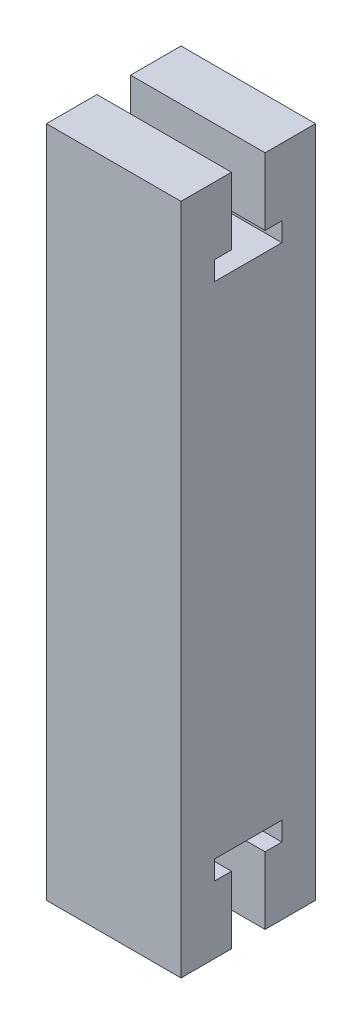
ISO-10303-21;
HEADER;
FILE_DESCRIPTION(('STEP AP214'),'2;1');
FILE_NAME('part.step','',(''),(''),'','','');
FILE_SCHEMA(('AUTOMOTIVE_DESIGN { 1 0 10303 214 1 1 1 1 }'));
ENDSEC;
DATA;
#1=APPLICATION_CONTEXT('core data for automotive mechanical design processes');
#2=APPLICATION_PROTOCOL_DEFINITION('international standard','automotive_design',2000,#1);
#3=PRODUCT_CONTEXT('',#1,'mechanical');
#4=PRODUCT('Part','Part','',(#3));
#5=PRODUCT_RELATED_PRODUCT_CATEGORY('part','',(#4));
#6=PRODUCT_DEFINITION_FORMATION('','',#4);
#7=PRODUCT_DEFINITION_CONTEXT('part definition',#1,'design');
#8=PRODUCT_DEFINITION('design','',#6,#7);
#9=PRODUCT_DEFINITION_SHAPE('','',#8);
#10=(LENGTH_UNIT() NAMED_UNIT(*) SI_UNIT(.MILLI.,.METRE.));
#11=(NAMED_UNIT(*) PLANE_ANGLE_UNIT() SI_UNIT($,.RADIAN.));
#12=(NAMED_UNIT(*) SI_UNIT($,.STERADIAN.) SOLID_ANGLE_UNIT());
#13=UNCERTAINTY_MEASURE_WITH_UNIT(LENGTH_MEASURE(1.E-05),#10,'distance_accuracy_value','');
#14=(GEOMETRIC_REPRESENTATION_CONTEXT(3) GLOBAL_UNCERTAINTY_ASSIGNED_CONTEXT((#13)) GLOBAL_UNIT_ASSIGNED_CONTEXT((#10,
#11,#12)) REPRESENTATION_CONTEXT('',''));
#15=CARTESIAN_POINT('',(0.,0.,0.));
#16=DIRECTION('',(0.,0.,1.));
#17=DIRECTION('',(1.,0.,0.));
#18=AXIS2_PLACEMENT_3D('',#15,#16,#17);
#19=CARTESIAN_POINT('',(0.,-50.,0.));
#20=DIRECTION('',(0.,1.,0.));
#21=DIRECTION('',(0.,0.,1.));
#22=AXIS2_PLACEMENT_3D('',#19,#20,#21);
#23=PLANE('',#22);
#24=DIRECTION('',(0.,0.,1.));
#25=VECTOR('',#24,1.);
#26=CARTESIAN_POINT('',(0.,-50.,0.));
#27=LINE('',#26,#25);
#28=CARTESIAN_POINT('',(0.,-50.,12.5));
#29=VERTEX_POINT('',#28);
#30=CARTESIAN_POINT('',(0.,-50.,20.));
#31=VERTEX_POINT('',#30);
#32=EDGE_CURVE('E306',#29,#31,#27,.T.);
#33=ORIENTED_EDGE('',*,*,#32,.F.);
#34=DIRECTION('',(-1.,0.,0.));
#35=VECTOR('',#34,1.);
#36=CARTESIAN_POINT('',(20.,-50.,12.5));
#37=LINE('',#36,#35);
#38=CARTESIAN_POINT('',(20.,-50.,12.5));
#39=VERTEX_POINT('',#38);
#40=EDGE_CURVE('E285',#39,#29,#37,.T.);
#41=ORIENTED_EDGE('',*,*,#40,.F.);
#42=DIRECTION('',(0.,0.,-1.));
#43=VECTOR('',#42,1.);
#44=CARTESIAN_POINT('',(20.,-50.,0.));
#45=LINE('',#44,#43);
#46=CARTESIAN_POINT('',(20.,-50.,20.));
#47=VERTEX_POINT('',#46);
#48=EDGE_CURVE('E314',#47,#39,#45,.T.);
#49=ORIENTED_EDGE('',*,*,#48,.F.);
#50=DIRECTION('',(1.,0.,0.));
#51=VECTOR('',#50,1.);
#52=CARTESIAN_POINT('',(0.,-50.,20.));
#53=LINE('',#52,#51);
#54=EDGE_CURVE('E310',#31,#47,#53,.T.);
#55=ORIENTED_EDGE('',*,*,#54,.F.);
#56=EDGE_LOOP('',(#33,#41,#49,#55));
#57=FACE_BOUND('',#56,.T.);
#58=ADVANCED_FACE('F33',(#57),#23,.F.);
#59=CARTESIAN_POINT('',(0.,50.,0.));
#60=DIRECTION('',(0.,1.,0.));
#61=DIRECTION('',(0.,0.,1.));
#62=AXIS2_PLACEMENT_3D('',#59,#60,#61);
#63=PLANE('',#62);
#64=DIRECTION('',(-1.,0.,0.));
#65=VECTOR('',#64,1.);
#66=CARTESIAN_POINT('',(20.,50.,12.5));
#67=LINE('',#66,#65);
#68=CARTESIAN_POINT('',(20.,50.,12.5));
#69=VERTEX_POINT('',#68);
#70=CARTESIAN_POINT('',(0.,50.,12.5));
#71=VERTEX_POINT('',#70);
#72=EDGE_CURVE('E225',#69,#71,#67,.T.);
#73=ORIENTED_EDGE('',*,*,#72,.T.);
#74=DIRECTION('',(0.,0.,1.));
#75=VECTOR('',#74,1.);
#76=CARTESIAN_POINT('',(0.,50.,0.));
#77=LINE('',#76,#75);
#78=CARTESIAN_POINT('',(0.,50.,20.));
#79=VERTEX_POINT('',#78);
#80=EDGE_CURVE('E228',#71,#79,#77,.T.);
#81=ORIENTED_EDGE('',*,*,#80,.T.);
#82=DIRECTION('',(1.,0.,0.));
#83=VECTOR('',#82,1.);
#84=CARTESIAN_POINT('',(0.,50.,20.));
#85=LINE('',#84,#83);
#86=CARTESIAN_POINT('',(20.,50.,20.));
#87=VERTEX_POINT('',#86);
#88=EDGE_CURVE('E297',#79,#87,#85,.T.);
#89=ORIENTED_EDGE('',*,*,#88,.T.);
#90=DIRECTION('',(0.,0.,-1.));
#91=VECTOR('',#90,1.);
#92=CARTESIAN_POINT('',(20.,50.,0.));
#93=LINE('',#92,#91);
#94=EDGE_CURVE('E300',#87,#69,#93,.T.);
#95=ORIENTED_EDGE('',*,*,#94,.T.);
#96=EDGE_LOOP('',(#73,#81,#89,#95));
#97=FACE_BOUND('',#96,.T.);
#98=ADVANCED_FACE('F334',(#97),#63,.T.);
#99=CARTESIAN_POINT('',(0.,-50.,0.));
#100=DIRECTION('',(-1.,0.,0.));
#101=DIRECTION('',(0.,0.,1.));
#102=AXIS2_PLACEMENT_3D('',#99,#100,#101);
#103=PLANE('',#102);
#104=DIRECTION('',(0.,1.,0.));
#105=VECTOR('',#104,1.);
#106=CARTESIAN_POINT('',(0.,50.,12.5));
#107=LINE('',#106,#105);
#108=CARTESIAN_POINT('',(0.,40.,12.5));
#109=VERTEX_POINT('',#108);
#110=EDGE_CURVE('E193',#109,#71,#107,.T.);
#111=ORIENTED_EDGE('',*,*,#110,.F.);
#112=DIRECTION('',(0.,0.,-1.));
#113=VECTOR('',#112,1.);
#114=CARTESIAN_POINT('',(0.,40.,12.5));
#115=LINE('',#114,#113);
#116=CARTESIAN_POINT('',(0.,40.,15.));
#117=VERTEX_POINT('',#116);
#118=EDGE_CURVE('E195',#117,#109,#115,.T.);
#119=ORIENTED_EDGE('',*,*,#118,.F.);
#120=DIRECTION('',(0.,1.,0.));
#121=VECTOR('',#120,1.);
#122=CARTESIAN_POINT('',(0.,40.,15.));
#123=LINE('',#122,#121);
#124=CARTESIAN_POINT('',(0.,37.1712254584082,15.));
#125=VERTEX_POINT('',#124);
#126=EDGE_CURVE('E220',#125,#117,#123,.T.);
#127=ORIENTED_EDGE('',*,*,#126,.F.);
#128=DIRECTION('',(0.,0.,1.));
#129=VECTOR('',#128,1.);
#130=CARTESIAN_POINT('',(0.,37.1712254584082,15.));
#131=LINE('',#130,#129);
#132=CARTESIAN_POINT('',(0.,37.1712254584082,5.));
#133=VERTEX_POINT('',#132);
#134=EDGE_CURVE('E217',#133,#125,#131,.T.);
#135=ORIENTED_EDGE('',*,*,#134,.F.);
#136=DIRECTION('',(0.,-1.,0.));
#137=VECTOR('',#136,1.);
#138=CARTESIAN_POINT('',(0.,37.1712254584082,5.));
#139=LINE('',#138,#137);
#140=CARTESIAN_POINT('',(0.,40.,5.));
#141=VERTEX_POINT('',#140);
#142=EDGE_CURVE('E214',#141,#133,#139,.T.);
#143=ORIENTED_EDGE('',*,*,#142,.F.);
#144=DIRECTION('',(0.,0.,-1.));
#145=VECTOR('',#144,1.);
#146=CARTESIAN_POINT('',(0.,40.,7.5));
#147=LINE('',#146,#145);
#148=CARTESIAN_POINT('',(0.,40.,7.5));
#149=VERTEX_POINT('',#148);
#150=EDGE_CURVE('E211',#149,#141,#147,.T.);
#151=ORIENTED_EDGE('',*,*,#150,.F.);
#152=DIRECTION('',(0.,-1.,0.));
#153=VECTOR('',#152,1.);
#154=CARTESIAN_POINT('',(0.,50.,7.5));
#155=LINE('',#154,#153);
#156=CARTESIAN_POINT('',(0.,50.,7.5));
#157=VERTEX_POINT('',#156);
#158=EDGE_CURVE('E173',#157,#149,#155,.T.);
#159=ORIENTED_EDGE('',*,*,#158,.F.);
#160=CARTESIAN_POINT('',(0.,50.,0.));
#161=VERTEX_POINT('',#160);
#162=EDGE_CURVE('E294',#161,#157,#77,.T.);
#163=ORIENTED_EDGE('',*,*,#162,.F.);
#164=DIRECTION('',(0.,1.,0.));
#165=VECTOR('',#164,1.);
#166=CARTESIAN_POINT('',(0.,-50.,0.));
#167=LINE('',#166,#165);
#168=CARTESIAN_POINT('',(0.,-50.,0.));
#169=VERTEX_POINT('',#168);
#170=EDGE_CURVE('E11',#169,#161,#167,.T.);
#171=ORIENTED_EDGE('',*,*,#170,.F.);
#172=CARTESIAN_POINT('',(0.,-50.,7.5));
#173=VERTEX_POINT('',#172);
#174=EDGE_CURVE('E307',#169,#173,#27,.T.);
#175=ORIENTED_EDGE('',*,*,#174,.T.);
#176=DIRECTION('',(0.,-1.,0.));
#177=VECTOR('',#176,1.);
#178=CARTESIAN_POINT('',(0.,-50.,7.5));
#179=LINE('',#178,#177);
#180=CARTESIAN_POINT('',(0.,-40.,7.5));
#181=VERTEX_POINT('',#180);
#182=EDGE_CURVE('E50',#181,#173,#179,.T.);
#183=ORIENTED_EDGE('',*,*,#182,.F.);
#184=DIRECTION('',(0.,0.,1.));
#185=VECTOR('',#184,1.);
#186=CARTESIAN_POINT('',(0.,-40.,7.5));
#187=LINE('',#186,#185);
#188=CARTESIAN_POINT('',(0.,-40.,5.));
#189=VERTEX_POINT('',#188);
#190=EDGE_CURVE('E268',#189,#181,#187,.T.);
#191=ORIENTED_EDGE('',*,*,#190,.F.);
#192=DIRECTION('',(0.,-1.,0.));
#193=VECTOR('',#192,1.);
#194=CARTESIAN_POINT('',(0.,-37.1712254584082,5.));
#195=LINE('',#194,#193);
#196=CARTESIAN_POINT('',(0.,-37.1712254584082,5.));
#197=VERTEX_POINT('',#196);
#198=EDGE_CURVE('E265',#197,#189,#195,.T.);
#199=ORIENTED_EDGE('',*,*,#198,.F.);
#200=DIRECTION('',(0.,0.,-1.));
#201=VECTOR('',#200,1.);
#202=CARTESIAN_POINT('',(0.,-37.1712254584082,15.));
#203=LINE('',#202,#201);
#204=CARTESIAN_POINT('',(0.,-37.1712254584082,15.));
#205=VERTEX_POINT('',#204);
#206=EDGE_CURVE('E262',#205,#197,#203,.T.);
#207=ORIENTED_EDGE('',*,*,#206,.F.);
#208=DIRECTION('',(0.,1.,0.));
#209=VECTOR('',#208,1.);
#210=CARTESIAN_POINT('',(0.,-40.,15.));
#211=LINE('',#210,#209);
#212=CARTESIAN_POINT('',(0.,-40.,15.));
#213=VERTEX_POINT('',#212);
#214=EDGE_CURVE('E243',#213,#205,#211,.T.);
#215=ORIENTED_EDGE('',*,*,#214,.F.);
#216=DIRECTION('',(0.,0.,1.));
#217=VECTOR('',#216,1.);
#218=CARTESIAN_POINT('',(0.,-40.,12.5));
#219=LINE('',#218,#217);
#220=CARTESIAN_POINT('',(0.,-40.,12.5));
#221=VERTEX_POINT('',#220);
#222=EDGE_CURVE('E275',#221,#213,#219,.T.);
#223=ORIENTED_EDGE('',*,*,#222,.F.);
#224=DIRECTION('',(0.,1.,0.));
#225=VECTOR('',#224,1.);
#226=CARTESIAN_POINT('',(0.,-50.,12.5));
#227=LINE('',#226,#225);
#228=EDGE_CURVE('E272',#29,#221,#227,.T.);
#229=ORIENTED_EDGE('',*,*,#228,.F.);
#230=ORIENTED_EDGE('',*,*,#32,.T.);
#231=DIRECTION('',(0.,1.,0.));
#232=VECTOR('',#231,1.);
#233=CARTESIAN_POINT('',(0.,-50.,20.));
#234=LINE('',#233,#232);
#235=EDGE_CURVE('E37',#31,#79,#234,.T.);
#236=ORIENTED_EDGE('',*,*,#235,.T.);
#237=ORIENTED_EDGE('',*,*,#80,.F.);
#238=EDGE_LOOP('',(#111,#119,#127,#135,#143,#151,#159,#163,#171,#175,#183,#191,#199,#207,#215,
#223,#229,#230,#236,#237));
#239=FACE_BOUND('',#238,.T.);
#240=ADVANCED_FACE('F35',(#239),#103,.T.);
#241=CARTESIAN_POINT('',(0.,-50.,0.));
#242=DIRECTION('',(0.,0.,-1.));
#243=DIRECTION('',(-1.,0.,0.));
#244=AXIS2_PLACEMENT_3D('',#241,#242,#243);
#245=PLANE('',#244);
#246=ORIENTED_EDGE('',*,*,#170,.T.);
#247=DIRECTION('',(-1.,0.,0.));
#248=VECTOR('',#247,1.);
#249=CARTESIAN_POINT('',(0.,50.,0.));
#250=LINE('',#249,#248);
#251=CARTESIAN_POINT('',(20.,50.,0.));
#252=VERTEX_POINT('',#251);
#253=EDGE_CURVE('E303',#252,#161,#250,.T.);
#254=ORIENTED_EDGE('',*,*,#253,.F.);
#255=DIRECTION('',(0.,1.,0.));
#256=VECTOR('',#255,1.);
#257=CARTESIAN_POINT('',(20.,-50.,0.));
#258=LINE('',#257,#256);
#259=CARTESIAN_POINT('',(20.,-50.,0.));
#260=VERTEX_POINT('',#259);
#261=EDGE_CURVE('E42',#260,#252,#258,.T.);
#262=ORIENTED_EDGE('',*,*,#261,.F.);
#263=DIRECTION('',(-1.,0.,0.));
#264=VECTOR('',#263,1.);
#265=CARTESIAN_POINT('',(0.,-50.,0.));
#266=LINE('',#265,#264);
#267=EDGE_CURVE('E317',#260,#169,#266,.T.);
#268=ORIENTED_EDGE('',*,*,#267,.T.);
#269=EDGE_LOOP('',(#246,#254,#262,#268));
#270=FACE_BOUND('',#269,.T.);
#271=ADVANCED_FACE('F386',(#270),#245,.T.);
#272=CARTESIAN_POINT('',(20.,-50.,0.));
#273=DIRECTION('',(1.,0.,0.));
#274=DIRECTION('',(0.,0.,-1.));
#275=AXIS2_PLACEMENT_3D('',#272,#273,#274);
#276=PLANE('',#275);
#277=DIRECTION('',(0.,1.,0.));
#278=VECTOR('',#277,1.);
#279=CARTESIAN_POINT('',(20.,50.,12.5));
#280=LINE('',#279,#278);
#281=CARTESIAN_POINT('',(20.,40.,12.5));
#282=VERTEX_POINT('',#281);
#283=EDGE_CURVE('E208',#282,#69,#280,.T.);
#284=ORIENTED_EDGE('',*,*,#283,.T.);
#285=ORIENTED_EDGE('',*,*,#94,.F.);
#286=DIRECTION('',(0.,1.,0.));
#287=VECTOR('',#286,1.);
#288=CARTESIAN_POINT('',(20.,-50.,20.));
#289=LINE('',#288,#287);
#290=EDGE_CURVE('E320',#47,#87,#289,.T.);
#291=ORIENTED_EDGE('',*,*,#290,.F.);
#292=ORIENTED_EDGE('',*,*,#48,.T.);
#293=DIRECTION('',(0.,1.,0.));
#294=VECTOR('',#293,1.);
#295=CARTESIAN_POINT('',(20.,-50.,12.5));
#296=LINE('',#295,#294);
#297=CARTESIAN_POINT('',(20.,-40.,12.5));
#298=VERTEX_POINT('',#297);
#299=EDGE_CURVE('E252',#39,#298,#296,.T.);
#300=ORIENTED_EDGE('',*,*,#299,.T.);
#301=DIRECTION('',(0.,0.,1.));
#302=VECTOR('',#301,1.);
#303=CARTESIAN_POINT('',(20.,-40.,12.5));
#304=LINE('',#303,#302);
#305=CARTESIAN_POINT('',(20.,-40.,15.));
#306=VERTEX_POINT('',#305);
#307=EDGE_CURVE('E255',#298,#306,#304,.T.);
#308=ORIENTED_EDGE('',*,*,#307,.T.);
#309=DIRECTION('',(0.,1.,0.));
#310=VECTOR('',#309,1.);
#311=CARTESIAN_POINT('',(20.,-40.,15.));
#312=LINE('',#311,#310);
#313=CARTESIAN_POINT('',(20.,-37.1712254584082,15.));
#314=VERTEX_POINT('',#313);
#315=EDGE_CURVE('E258',#306,#314,#312,.T.);
#316=ORIENTED_EDGE('',*,*,#315,.T.);
#317=DIRECTION('',(0.,0.,-1.));
#318=VECTOR('',#317,1.);
#319=CARTESIAN_POINT('',(20.,-37.1712254584082,15.));
#320=LINE('',#319,#318);
#321=CARTESIAN_POINT('',(20.,-37.1712254584082,5.));
#322=VERTEX_POINT('',#321);
#323=EDGE_CURVE('E239',#314,#322,#320,.T.);
#324=ORIENTED_EDGE('',*,*,#323,.T.);
#325=DIRECTION('',(0.,-1.,0.));
#326=VECTOR('',#325,1.);
#327=CARTESIAN_POINT('',(20.,-37.1712254584082,5.));
#328=LINE('',#327,#326);
#329=CARTESIAN_POINT('',(20.,-40.,5.));
#330=VERTEX_POINT('',#329);
#331=EDGE_CURVE('E242',#322,#330,#328,.T.);
#332=ORIENTED_EDGE('',*,*,#331,.T.);
#333=DIRECTION('',(0.,0.,1.));
#334=VECTOR('',#333,1.);
#335=CARTESIAN_POINT('',(20.,-40.,7.5));
#336=LINE('',#335,#334);
#337=CARTESIAN_POINT('',(20.,-40.,7.5));
#338=VERTEX_POINT('',#337);
#339=EDGE_CURVE('E246',#330,#338,#336,.T.);
#340=ORIENTED_EDGE('',*,*,#339,.T.);
#341=DIRECTION('',(0.,-1.,0.));
#342=VECTOR('',#341,1.);
#343=CARTESIAN_POINT('',(20.,-50.,7.5));
#344=LINE('',#343,#342);
#345=CARTESIAN_POINT('',(20.,-50.,7.5));
#346=VERTEX_POINT('',#345);
#347=EDGE_CURVE('E249',#338,#346,#344,.T.);
#348=ORIENTED_EDGE('',*,*,#347,.T.);
#349=EDGE_CURVE('E313',#346,#260,#45,.T.);
#350=ORIENTED_EDGE('',*,*,#349,.T.);
#351=ORIENTED_EDGE('',*,*,#261,.T.);
#352=CARTESIAN_POINT('',(20.,50.,7.5));
#353=VERTEX_POINT('',#352);
#354=EDGE_CURVE('E192',#353,#252,#93,.T.);
#355=ORIENTED_EDGE('',*,*,#354,.F.);
#356=DIRECTION('',(0.,-1.,0.));
#357=VECTOR('',#356,1.);
#358=CARTESIAN_POINT('',(20.,50.,7.5));
#359=LINE('',#358,#357);
#360=CARTESIAN_POINT('',(20.,40.,7.5));
#361=VERTEX_POINT('',#360);
#362=EDGE_CURVE('E58',#353,#361,#359,.T.);
#363=ORIENTED_EDGE('',*,*,#362,.T.);
#364=DIRECTION('',(0.,0.,-1.));
#365=VECTOR('',#364,1.);
#366=CARTESIAN_POINT('',(20.,40.,7.5));
#367=LINE('',#366,#365);
#368=CARTESIAN_POINT('',(20.,40.,5.));
#369=VERTEX_POINT('',#368);
#370=EDGE_CURVE('E181',#361,#369,#367,.T.);
#371=ORIENTED_EDGE('',*,*,#370,.T.);
#372=DIRECTION('',(0.,-1.,0.));
#373=VECTOR('',#372,1.);
#374=CARTESIAN_POINT('',(20.,37.1712254584082,5.));
#375=LINE('',#374,#373);
#376=CARTESIAN_POINT('',(20.,37.1712254584082,5.));
#377=VERTEX_POINT('',#376);
#378=EDGE_CURVE('E186',#369,#377,#375,.T.);
#379=ORIENTED_EDGE('',*,*,#378,.T.);
#380=DIRECTION('',(0.,0.,1.));
#381=VECTOR('',#380,1.);
#382=CARTESIAN_POINT('',(20.,37.1712254584082,15.));
#383=LINE('',#382,#381);
#384=CARTESIAN_POINT('',(20.,37.1712254584082,15.));
#385=VERTEX_POINT('',#384);
#386=EDGE_CURVE('E199',#377,#385,#383,.T.);
#387=ORIENTED_EDGE('',*,*,#386,.T.);
#388=DIRECTION('',(0.,1.,0.));
#389=VECTOR('',#388,1.);
#390=CARTESIAN_POINT('',(20.,40.,15.));
#391=LINE('',#390,#389);
#392=CARTESIAN_POINT('',(20.,40.,15.));
#393=VERTEX_POINT('',#392);
#394=EDGE_CURVE('E202',#385,#393,#391,.T.);
#395=ORIENTED_EDGE('',*,*,#394,.T.);
#396=DIRECTION('',(0.,0.,-1.));
#397=VECTOR('',#396,1.);
#398=CARTESIAN_POINT('',(20.,40.,12.5));
#399=LINE('',#398,#397);
#400=EDGE_CURVE('E205',#393,#282,#399,.T.);
#401=ORIENTED_EDGE('',*,*,#400,.T.);
#402=EDGE_LOOP('',(#284,#285,#291,#292,#300,#308,#316,#324,#332,#340,#348,#350,#351,#355,#363,
#371,#379,#387,#395,#401));
#403=FACE_BOUND('',#402,.T.);
#404=ADVANCED_FACE('F190',(#403),#276,.T.);
#405=CARTESIAN_POINT('',(0.,-50.,20.));
#406=DIRECTION('',(0.,0.,1.));
#407=DIRECTION('',(1.,0.,0.));
#408=AXIS2_PLACEMENT_3D('',#405,#406,#407);
#409=PLANE('',#408);
#410=ORIENTED_EDGE('',*,*,#290,.T.);
#411=ORIENTED_EDGE('',*,*,#88,.F.);
#412=ORIENTED_EDGE('',*,*,#235,.F.);
#413=ORIENTED_EDGE('',*,*,#54,.T.);
#414=EDGE_LOOP('',(#410,#411,#412,#413));
#415=FACE_BOUND('',#414,.T.);
#416=ADVANCED_FACE('F331',(#415),#409,.T.);
#417=ORIENTED_EDGE('',*,*,#349,.F.);
#418=DIRECTION('',(-1.,0.,0.));
#419=VECTOR('',#418,1.);
#420=CARTESIAN_POINT('',(20.,-50.,7.5));
#421=LINE('',#420,#419);
#422=EDGE_CURVE('E287',#346,#173,#421,.T.);
#423=ORIENTED_EDGE('',*,*,#422,.T.);
#424=ORIENTED_EDGE('',*,*,#174,.F.);
#425=ORIENTED_EDGE('',*,*,#267,.F.);
#426=EDGE_LOOP('',(#417,#423,#424,#425));
#427=FACE_BOUND('',#426,.T.);
#428=ADVANCED_FACE('F365',(#427),#23,.F.);
#429=DIRECTION('',(-1.,0.,0.));
#430=VECTOR('',#429,1.);
#431=CARTESIAN_POINT('',(20.,50.,7.5));
#432=LINE('',#431,#430);
#433=EDGE_CURVE('E178',#353,#157,#432,.T.);
#434=ORIENTED_EDGE('',*,*,#433,.F.);
#435=ORIENTED_EDGE('',*,*,#354,.T.);
#436=ORIENTED_EDGE('',*,*,#253,.T.);
#437=ORIENTED_EDGE('',*,*,#162,.T.);
#438=EDGE_LOOP('',(#434,#435,#436,#437));
#439=FACE_BOUND('',#438,.T.);
#440=ADVANCED_FACE('F370',(#439),#63,.T.);
#441=CARTESIAN_POINT('',(20.,50.,12.5));
#442=DIRECTION('',(0.,0.,1.));
#443=DIRECTION('',(0.,-1.,0.));
#444=AXIS2_PLACEMENT_3D('',#441,#442,#443);
#445=PLANE('',#444);
#446=ORIENTED_EDGE('',*,*,#110,.T.);
#447=ORIENTED_EDGE('',*,*,#72,.F.);
#448=ORIENTED_EDGE('',*,*,#283,.F.);
#449=DIRECTION('',(-1.,0.,0.));
#450=VECTOR('',#449,1.);
#451=CARTESIAN_POINT('',(20.,40.,12.5));
#452=LINE('',#451,#450);
#453=EDGE_CURVE('E229',#282,#109,#452,.T.);
#454=ORIENTED_EDGE('',*,*,#453,.T.);
#455=EDGE_LOOP('',(#446,#447,#448,#454));
#456=FACE_BOUND('',#455,.T.);
#457=ADVANCED_FACE('F339',(#456),#445,.F.);
#458=CARTESIAN_POINT('',(20.,40.,12.5));
#459=DIRECTION('',(0.,1.,0.));
#460=DIRECTION('',(0.,0.,1.));
#461=AXIS2_PLACEMENT_3D('',#458,#459,#460);
#462=PLANE('',#461);
#463=ORIENTED_EDGE('',*,*,#118,.T.);
#464=ORIENTED_EDGE('',*,*,#453,.F.);
#465=ORIENTED_EDGE('',*,*,#400,.F.);
#466=DIRECTION('',(-1.,0.,0.));
#467=VECTOR('',#466,1.);
#468=CARTESIAN_POINT('',(20.,40.,15.));
#469=LINE('',#468,#467);
#470=EDGE_CURVE('E231',#393,#117,#469,.T.);
#471=ORIENTED_EDGE('',*,*,#470,.T.);
#472=EDGE_LOOP('',(#463,#464,#465,#471));
#473=FACE_BOUND('',#472,.T.);
#474=ADVANCED_FACE('F344',(#473),#462,.F.);
#475=CARTESIAN_POINT('',(20.,40.,15.));
#476=DIRECTION('',(0.,0.,1.));
#477=DIRECTION('',(1.,0.,0.));
#478=AXIS2_PLACEMENT_3D('',#475,#476,#477);
#479=PLANE('',#478);
#480=ORIENTED_EDGE('',*,*,#126,.T.);
#481=ORIENTED_EDGE('',*,*,#470,.F.);
#482=ORIENTED_EDGE('',*,*,#394,.F.);
#483=DIRECTION('',(-1.,0.,0.));
#484=VECTOR('',#483,1.);
#485=CARTESIAN_POINT('',(20.,37.1712254584082,15.));
#486=LINE('',#485,#484);
#487=EDGE_CURVE('E233',#385,#125,#486,.T.);
#488=ORIENTED_EDGE('',*,*,#487,.T.);
#489=EDGE_LOOP('',(#480,#481,#482,#488));
#490=FACE_BOUND('',#489,.T.);
#491=ADVANCED_FACE('F347',(#490),#479,.F.);
#492=CARTESIAN_POINT('',(20.,37.1712254584082,15.));
#493=DIRECTION('',(0.,-1.,0.));
#494=DIRECTION('',(0.,0.,-1.));
#495=AXIS2_PLACEMENT_3D('',#492,#493,#494);
#496=PLANE('',#495);
#497=ORIENTED_EDGE('',*,*,#134,.T.);
#498=ORIENTED_EDGE('',*,*,#487,.F.);
#499=ORIENTED_EDGE('',*,*,#386,.F.);
#500=DIRECTION('',(-1.,0.,0.));
#501=VECTOR('',#500,1.);
#502=CARTESIAN_POINT('',(20.,37.1712254584082,5.));
#503=LINE('',#502,#501);
#504=EDGE_CURVE('E235',#377,#133,#503,.T.);
#505=ORIENTED_EDGE('',*,*,#504,.T.);
#506=EDGE_LOOP('',(#497,#498,#499,#505));
#507=FACE_BOUND('',#506,.T.);
#508=ADVANCED_FACE('F350',(#507),#496,.F.);
#509=CARTESIAN_POINT('',(20.,37.1712254584082,5.));
#510=DIRECTION('',(0.,0.,-1.));
#511=DIRECTION('',(-1.,0.,0.));
#512=AXIS2_PLACEMENT_3D('',#509,#510,#511);
#513=PLANE('',#512);
#514=ORIENTED_EDGE('',*,*,#142,.T.);
#515=ORIENTED_EDGE('',*,*,#504,.F.);
#516=ORIENTED_EDGE('',*,*,#378,.F.);
#517=DIRECTION('',(-1.,0.,0.));
#518=VECTOR('',#517,1.);
#519=CARTESIAN_POINT('',(20.,40.,5.));
#520=LINE('',#519,#518);
#521=EDGE_CURVE('E177',#369,#141,#520,.T.);
#522=ORIENTED_EDGE('',*,*,#521,.T.);
#523=EDGE_LOOP('',(#514,#515,#516,#522));
#524=FACE_BOUND('',#523,.T.);
#525=ADVANCED_FACE('F353',(#524),#513,.F.);
#526=CARTESIAN_POINT('',(20.,40.,7.5));
#527=DIRECTION('',(0.,1.,0.));
#528=DIRECTION('',(0.,0.,1.));
#529=AXIS2_PLACEMENT_3D('',#526,#527,#528);
#530=PLANE('',#529);
#531=ORIENTED_EDGE('',*,*,#150,.T.);
#532=ORIENTED_EDGE('',*,*,#521,.F.);
#533=ORIENTED_EDGE('',*,*,#370,.F.);
#534=DIRECTION('',(-1.,0.,0.));
#535=VECTOR('',#534,1.);
#536=CARTESIAN_POINT('',(20.,40.,7.5));
#537=LINE('',#536,#535);
#538=EDGE_CURVE('E169',#361,#149,#537,.T.);
#539=ORIENTED_EDGE('',*,*,#538,.T.);
#540=EDGE_LOOP('',(#531,#532,#533,#539));
#541=FACE_BOUND('',#540,.T.);
#542=ADVANCED_FACE('F182',(#541),#530,.F.);
#543=CARTESIAN_POINT('',(20.,50.,7.5));
#544=DIRECTION('',(0.,0.,-1.));
#545=DIRECTION('',(-1.,0.,0.));
#546=AXIS2_PLACEMENT_3D('',#543,#544,#545);
#547=PLANE('',#546);
#548=ORIENTED_EDGE('',*,*,#158,.T.);
#549=ORIENTED_EDGE('',*,*,#538,.F.);
#550=ORIENTED_EDGE('',*,*,#362,.F.);
#551=ORIENTED_EDGE('',*,*,#433,.T.);
#552=EDGE_LOOP('',(#548,#549,#550,#551));
#553=FACE_BOUND('',#552,.T.);
#554=ADVANCED_FACE('F171',(#553),#547,.F.);
#555=CARTESIAN_POINT('',(20.,-37.1712254584082,15.));
#556=DIRECTION('',(0.,1.,0.));
#557=DIRECTION('',(0.,0.,1.));
#558=AXIS2_PLACEMENT_3D('',#555,#556,#557);
#559=PLANE('',#558);
#560=ORIENTED_EDGE('',*,*,#206,.T.);
#561=DIRECTION('',(-1.,0.,0.));
#562=VECTOR('',#561,1.);
#563=CARTESIAN_POINT('',(20.,-37.1712254584082,5.));
#564=LINE('',#563,#562);
#565=EDGE_CURVE('E261',#322,#197,#564,.T.);
#566=ORIENTED_EDGE('',*,*,#565,.F.);
#567=ORIENTED_EDGE('',*,*,#323,.F.);
#568=DIRECTION('',(-1.,0.,0.));
#569=VECTOR('',#568,1.);
#570=CARTESIAN_POINT('',(20.,-37.1712254584082,15.));
#571=LINE('',#570,#569);
#572=EDGE_CURVE('E212',#314,#205,#571,.T.);
#573=ORIENTED_EDGE('',*,*,#572,.T.);
#574=EDGE_LOOP('',(#560,#566,#567,#573));
#575=FACE_BOUND('',#574,.T.);
#576=ADVANCED_FACE('F399',(#575),#559,.F.);
#577=CARTESIAN_POINT('',(20.,-40.,15.));
#578=DIRECTION('',(0.,0.,1.));
#579=DIRECTION('',(1.,0.,0.));
#580=AXIS2_PLACEMENT_3D('',#577,#578,#579);
#581=PLANE('',#580);
#582=ORIENTED_EDGE('',*,*,#214,.T.);
#583=ORIENTED_EDGE('',*,*,#572,.F.);
#584=ORIENTED_EDGE('',*,*,#315,.F.);
#585=DIRECTION('',(-1.,0.,0.));
#586=VECTOR('',#585,1.);
#587=CARTESIAN_POINT('',(20.,-40.,15.));
#588=LINE('',#587,#586);
#589=EDGE_CURVE('E281',#306,#213,#588,.T.);
#590=ORIENTED_EDGE('',*,*,#589,.T.);
#591=EDGE_LOOP('',(#582,#583,#584,#590));
#592=FACE_BOUND('',#591,.T.);
#593=ADVANCED_FACE('F403',(#592),#581,.F.);
#594=CARTESIAN_POINT('',(20.,-40.,12.5));
#595=DIRECTION('',(0.,-1.,0.));
#596=DIRECTION('',(0.,0.,-1.));
#597=AXIS2_PLACEMENT_3D('',#594,#595,#596);
#598=PLANE('',#597);
#599=ORIENTED_EDGE('',*,*,#222,.T.);
#600=ORIENTED_EDGE('',*,*,#589,.F.);
#601=ORIENTED_EDGE('',*,*,#307,.F.);
#602=DIRECTION('',(-1.,0.,0.));
#603=VECTOR('',#602,1.);
#604=CARTESIAN_POINT('',(20.,-40.,12.5));
#605=LINE('',#604,#603);
#606=EDGE_CURVE('E283',#298,#221,#605,.T.);
#607=ORIENTED_EDGE('',*,*,#606,.T.);
#608=EDGE_LOOP('',(#599,#600,#601,#607));
#609=FACE_BOUND('',#608,.T.);
#610=ADVANCED_FACE('F407',(#609),#598,.F.);
#611=CARTESIAN_POINT('',(20.,-50.,12.5));
#612=DIRECTION('',(0.,0.,1.));
#613=DIRECTION('',(0.,-1.,0.));
#614=AXIS2_PLACEMENT_3D('',#611,#612,#613);
#615=PLANE('',#614);
#616=ORIENTED_EDGE('',*,*,#228,.T.);
#617=ORIENTED_EDGE('',*,*,#606,.F.);
#618=ORIENTED_EDGE('',*,*,#299,.F.);
#619=ORIENTED_EDGE('',*,*,#40,.T.);
#620=EDGE_LOOP('',(#616,#617,#618,#619));
#621=FACE_BOUND('',#620,.T.);
#622=ADVANCED_FACE('F409',(#621),#615,.F.);
#623=CARTESIAN_POINT('',(20.,-50.,7.5));
#624=DIRECTION('',(0.,0.,-1.));
#625=DIRECTION('',(-1.,0.,0.));
#626=AXIS2_PLACEMENT_3D('',#623,#624,#625);
#627=PLANE('',#626);
#628=ORIENTED_EDGE('',*,*,#182,.T.);
#629=ORIENTED_EDGE('',*,*,#422,.F.);
#630=ORIENTED_EDGE('',*,*,#347,.F.);
#631=DIRECTION('',(-1.,0.,0.));
#632=VECTOR('',#631,1.);
#633=CARTESIAN_POINT('',(20.,-40.,7.5));
#634=LINE('',#633,#632);
#635=EDGE_CURVE('E289',#338,#181,#634,.T.);
#636=ORIENTED_EDGE('',*,*,#635,.T.);
#637=EDGE_LOOP('',(#628,#629,#630,#636));
#638=FACE_BOUND('',#637,.T.);
#639=ADVANCED_FACE('F412',(#638),#627,.F.);
#640=CARTESIAN_POINT('',(20.,-40.,7.5));
#641=DIRECTION('',(0.,-1.,0.));
#642=DIRECTION('',(0.,0.,-1.));
#643=AXIS2_PLACEMENT_3D('',#640,#641,#642);
#644=PLANE('',#643);
#645=ORIENTED_EDGE('',*,*,#190,.T.);
#646=ORIENTED_EDGE('',*,*,#635,.F.);
#647=ORIENTED_EDGE('',*,*,#339,.F.);
#648=DIRECTION('',(-1.,0.,0.));
#649=VECTOR('',#648,1.);
#650=CARTESIAN_POINT('',(20.,-40.,5.));
#651=LINE('',#650,#649);
#652=EDGE_CURVE('E291',#330,#189,#651,.T.);
#653=ORIENTED_EDGE('',*,*,#652,.T.);
#654=EDGE_LOOP('',(#645,#646,#647,#653));
#655=FACE_BOUND('',#654,.T.);
#656=ADVANCED_FACE('F392',(#655),#644,.F.);
#657=CARTESIAN_POINT('',(20.,-37.1712254584082,5.));
#658=DIRECTION('',(0.,0.,-1.));
#659=DIRECTION('',(-1.,0.,0.));
#660=AXIS2_PLACEMENT_3D('',#657,#658,#659);
#661=PLANE('',#660);
#662=ORIENTED_EDGE('',*,*,#198,.T.);
#663=ORIENTED_EDGE('',*,*,#652,.F.);
#664=ORIENTED_EDGE('',*,*,#331,.F.);
#665=ORIENTED_EDGE('',*,*,#565,.T.);
#666=EDGE_LOOP('',(#662,#663,#664,#665));
#667=FACE_BOUND('',#666,.T.);
#668=ADVANCED_FACE('F396',(#667),#661,.F.);
#669=CLOSED_SHELL('',(#58,#98,#240,#271,#404,#416,#428,#440,#457,#474,#491,#508,#525,#542,#554,
#576,#593,#610,#622,#639,#656,#668));
#670=MANIFOLD_SOLID_BREP('B2',#669);
#671=ADVANCED_BREP_SHAPE_REPRESENTATION('',(#18,#670),#14);
#672=SHAPE_DEFINITION_REPRESENTATION(#9,#671);
ENDSEC;
END-ISO-10303-21;
